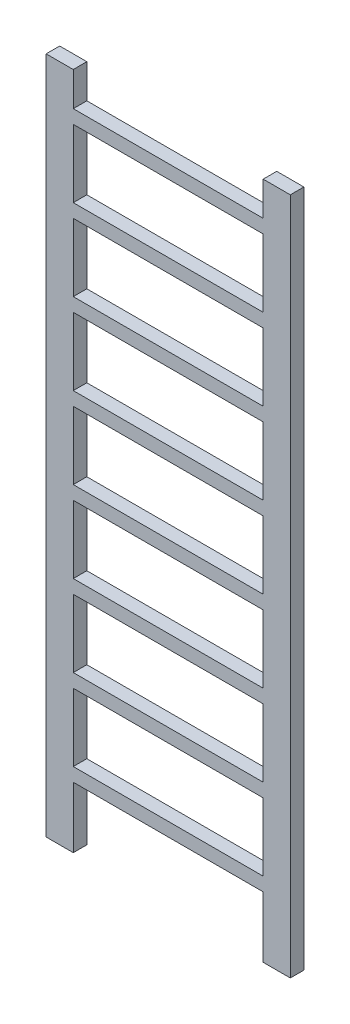
ISO-10303-21;
HEADER;
FILE_DESCRIPTION(('STEP AP214'),'2;1');
FILE_NAME('part.step','',(''),(''),'','','');
FILE_SCHEMA(('AUTOMOTIVE_DESIGN { 1 0 10303 214 1 1 1 1 }'));
ENDSEC;
DATA;
#1=APPLICATION_CONTEXT('core data for automotive mechanical design processes');
#2=APPLICATION_PROTOCOL_DEFINITION('international standard','automotive_design',2000,#1);
#3=PRODUCT_CONTEXT('',#1,'mechanical');
#4=PRODUCT('Part','Part','',(#3));
#5=PRODUCT_RELATED_PRODUCT_CATEGORY('part','',(#4));
#6=PRODUCT_DEFINITION_FORMATION('','',#4);
#7=PRODUCT_DEFINITION_CONTEXT('part definition',#1,'design');
#8=PRODUCT_DEFINITION('design','',#6,#7);
#9=PRODUCT_DEFINITION_SHAPE('','',#8);
#10=(LENGTH_UNIT() NAMED_UNIT(*) SI_UNIT(.MILLI.,.METRE.));
#11=(NAMED_UNIT(*) PLANE_ANGLE_UNIT() SI_UNIT($,.RADIAN.));
#12=(NAMED_UNIT(*) SI_UNIT($,.STERADIAN.) SOLID_ANGLE_UNIT());
#13=UNCERTAINTY_MEASURE_WITH_UNIT(LENGTH_MEASURE(1.E-05),#10,'distance_accuracy_value','');
#14=(GEOMETRIC_REPRESENTATION_CONTEXT(3) GLOBAL_UNCERTAINTY_ASSIGNED_CONTEXT((#13)) GLOBAL_UNIT_ASSIGNED_CONTEXT((#10,
#11,#12)) REPRESENTATION_CONTEXT('',''));
#15=CARTESIAN_POINT('',(0.,0.,0.));
#16=DIRECTION('',(0.,0.,1.));
#17=DIRECTION('',(1.,0.,0.));
#18=AXIS2_PLACEMENT_3D('',#15,#16,#17);
#19=CARTESIAN_POINT('',(-350.,-1250.,50.));
#20=DIRECTION('',(-1.,0.,0.));
#21=DIRECTION('',(0.,0.,1.));
#22=AXIS2_PLACEMENT_3D('',#19,#20,#21);
#23=PLANE('',#22);
#24=DIRECTION('',(0.,0.,1.));
#25=VECTOR('',#24,1.);
#26=CARTESIAN_POINT('',(-350.,-975.,50.));
#27=LINE('',#26,#25);
#28=CARTESIAN_POINT('',(-350.,-975.,0.));
#29=VERTEX_POINT('',#28);
#30=CARTESIAN_POINT('',(-350.,-975.,50.));
#31=VERTEX_POINT('',#30);
#32=EDGE_CURVE('E333',#29,#31,#27,.T.);
#33=ORIENTED_EDGE('',*,*,#32,.F.);
#34=DIRECTION('',(0.,1.,0.));
#35=VECTOR('',#34,1.);
#36=CARTESIAN_POINT('',(-350.,-1250.,0.));
#37=LINE('',#36,#35);
#38=CARTESIAN_POINT('',(-350.,-725.,0.));
#39=VERTEX_POINT('',#38);
#40=EDGE_CURVE('E537',#29,#39,#37,.T.);
#41=ORIENTED_EDGE('',*,*,#40,.T.);
#42=DIRECTION('',(0.,0.,-1.));
#43=VECTOR('',#42,1.);
#44=CARTESIAN_POINT('',(-350.,-725.,50.));
#45=LINE('',#44,#43);
#46=CARTESIAN_POINT('',(-350.,-725.,50.));
#47=VERTEX_POINT('',#46);
#48=EDGE_CURVE('E351',#47,#39,#45,.T.);
#49=ORIENTED_EDGE('',*,*,#48,.F.);
#50=DIRECTION('',(0.,1.,0.));
#51=VECTOR('',#50,1.);
#52=CARTESIAN_POINT('',(-350.,-1250.,50.));
#53=LINE('',#52,#51);
#54=EDGE_CURVE('E526',#31,#47,#53,.T.);
#55=ORIENTED_EDGE('',*,*,#54,.F.);
#56=EDGE_LOOP('',(#33,#41,#49,#55));
#57=FACE_BOUND('',#56,.T.);
#58=ADVANCED_FACE('F41',(#57),#23,.F.);
#59=DIRECTION('',(0.,0.,-1.));
#60=VECTOR('',#59,1.);
#61=CARTESIAN_POINT('',(-350.,-1025.,50.));
#62=LINE('',#61,#60);
#63=CARTESIAN_POINT('',(-350.,-1025.,50.));
#64=VERTEX_POINT('',#63);
#65=CARTESIAN_POINT('',(-350.,-1025.,0.));
#66=VERTEX_POINT('',#65);
#67=EDGE_CURVE('E317',#64,#66,#62,.T.);
#68=ORIENTED_EDGE('',*,*,#67,.F.);
#69=CARTESIAN_POINT('',(-350.,-1250.,50.));
#70=VERTEX_POINT('',#69);
#71=EDGE_CURVE('E522',#70,#64,#53,.T.);
#72=ORIENTED_EDGE('',*,*,#71,.F.);
#73=DIRECTION('',(0.,0.,-1.));
#74=VECTOR('',#73,1.);
#75=CARTESIAN_POINT('',(-350.,-1250.,50.));
#76=LINE('',#75,#74);
#77=CARTESIAN_POINT('',(-350.,-1250.,0.));
#78=VERTEX_POINT('',#77);
#79=EDGE_CURVE('E533',#70,#78,#76,.T.);
#80=ORIENTED_EDGE('',*,*,#79,.T.);
#81=EDGE_CURVE('E534',#78,#66,#37,.T.);
#82=ORIENTED_EDGE('',*,*,#81,.T.);
#83=EDGE_LOOP('',(#68,#72,#80,#82));
#84=FACE_BOUND('',#83,.T.);
#85=ADVANCED_FACE('F724',(#84),#23,.F.);
#86=CARTESIAN_POINT('',(350.,-1250.,50.));
#87=DIRECTION('',(1.,0.,0.));
#88=DIRECTION('',(0.,0.,-1.));
#89=AXIS2_PLACEMENT_3D('',#86,#87,#88);
#90=PLANE('',#89);
#91=DIRECTION('',(0.,0.,-1.));
#92=VECTOR('',#91,1.);
#93=CARTESIAN_POINT('',(350.,-975.,50.));
#94=LINE('',#93,#92);
#95=CARTESIAN_POINT('',(350.,-975.,50.));
#96=VERTEX_POINT('',#95);
#97=CARTESIAN_POINT('',(350.,-975.,0.));
#98=VERTEX_POINT('',#97);
#99=EDGE_CURVE('E64',#96,#98,#94,.T.);
#100=ORIENTED_EDGE('',*,*,#99,.F.);
#101=DIRECTION('',(0.,-1.,0.));
#102=VECTOR('',#101,1.);
#103=CARTESIAN_POINT('',(350.,-1250.,50.));
#104=LINE('',#103,#102);
#105=CARTESIAN_POINT('',(350.,-725.,50.));
#106=VERTEX_POINT('',#105);
#107=EDGE_CURVE('E607',#106,#96,#104,.T.);
#108=ORIENTED_EDGE('',*,*,#107,.F.);
#109=DIRECTION('',(0.,0.,1.));
#110=VECTOR('',#109,1.);
#111=CARTESIAN_POINT('',(350.,-725.,50.));
#112=LINE('',#111,#110);
#113=CARTESIAN_POINT('',(350.,-725.,0.));
#114=VERTEX_POINT('',#113);
#115=EDGE_CURVE('E344',#114,#106,#112,.T.);
#116=ORIENTED_EDGE('',*,*,#115,.F.);
#117=DIRECTION('',(0.,-1.,0.));
#118=VECTOR('',#117,1.);
#119=CARTESIAN_POINT('',(350.,-1250.,0.));
#120=LINE('',#119,#118);
#121=EDGE_CURVE('E308',#114,#98,#120,.T.);
#122=ORIENTED_EDGE('',*,*,#121,.T.);
#123=EDGE_LOOP('',(#100,#108,#116,#122));
#124=FACE_BOUND('',#123,.T.);
#125=ADVANCED_FACE('F594',(#124),#90,.F.);
#126=DIRECTION('',(0.,0.,1.));
#127=VECTOR('',#126,1.);
#128=CARTESIAN_POINT('',(350.,-1025.,50.));
#129=LINE('',#128,#127);
#130=CARTESIAN_POINT('',(350.,-1025.,0.));
#131=VERTEX_POINT('',#130);
#132=CARTESIAN_POINT('',(350.,-1025.,50.));
#133=VERTEX_POINT('',#132);
#134=EDGE_CURVE('E312',#131,#133,#129,.T.);
#135=ORIENTED_EDGE('',*,*,#134,.F.);
#136=CARTESIAN_POINT('',(350.,-1250.,0.));
#137=VERTEX_POINT('',#136);
#138=EDGE_CURVE('E299',#131,#137,#120,.T.);
#139=ORIENTED_EDGE('',*,*,#138,.T.);
#140=DIRECTION('',(0.,0.,-1.));
#141=VECTOR('',#140,1.);
#142=CARTESIAN_POINT('',(350.,-1250.,50.));
#143=LINE('',#142,#141);
#144=CARTESIAN_POINT('',(350.,-1250.,50.));
#145=VERTEX_POINT('',#144);
#146=EDGE_CURVE('E495',#145,#137,#143,.T.);
#147=ORIENTED_EDGE('',*,*,#146,.F.);
#148=EDGE_CURVE('E56',#133,#145,#104,.T.);
#149=ORIENTED_EDGE('',*,*,#148,.F.);
#150=EDGE_LOOP('',(#135,#139,#147,#149));
#151=FACE_BOUND('',#150,.T.);
#152=ADVANCED_FACE('F313',(#151),#90,.F.);
#153=DIRECTION('',(0.,0.,1.));
#154=VECTOR('',#153,1.);
#155=CARTESIAN_POINT('',(-350.,-675.,50.));
#156=LINE('',#155,#154);
#157=CARTESIAN_POINT('',(-350.,-675.,0.));
#158=VERTEX_POINT('',#157);
#159=CARTESIAN_POINT('',(-350.,-675.,50.));
#160=VERTEX_POINT('',#159);
#161=EDGE_CURVE('E357',#158,#160,#156,.T.);
#162=ORIENTED_EDGE('',*,*,#161,.F.);
#163=CARTESIAN_POINT('',(-350.,-425.,0.));
#164=VERTEX_POINT('',#163);
#165=EDGE_CURVE('E604',#158,#164,#37,.T.);
#166=ORIENTED_EDGE('',*,*,#165,.T.);
#167=DIRECTION('',(0.,0.,-1.));
#168=VECTOR('',#167,1.);
#169=CARTESIAN_POINT('',(-350.,-425.,50.));
#170=LINE('',#169,#168);
#171=CARTESIAN_POINT('',(-350.,-425.,50.));
#172=VERTEX_POINT('',#171);
#173=EDGE_CURVE('E375',#172,#164,#170,.T.);
#174=ORIENTED_EDGE('',*,*,#173,.F.);
#175=EDGE_CURVE('E678',#160,#172,#53,.T.);
#176=ORIENTED_EDGE('',*,*,#175,.F.);
#177=EDGE_LOOP('',(#162,#166,#174,#176));
#178=FACE_BOUND('',#177,.T.);
#179=ADVANCED_FACE('F701',(#178),#23,.F.);
#180=DIRECTION('',(0.,0.,-1.));
#181=VECTOR('',#180,1.);
#182=CARTESIAN_POINT('',(350.,-675.,50.));
#183=LINE('',#182,#181);
#184=CARTESIAN_POINT('',(350.,-675.,50.));
#185=VERTEX_POINT('',#184);
#186=CARTESIAN_POINT('',(350.,-675.,0.));
#187=VERTEX_POINT('',#186);
#188=EDGE_CURVE('E354',#185,#187,#183,.T.);
#189=ORIENTED_EDGE('',*,*,#188,.F.);
#190=CARTESIAN_POINT('',(350.,-425.,50.));
#191=VERTEX_POINT('',#190);
#192=EDGE_CURVE('E609',#191,#185,#104,.T.);
#193=ORIENTED_EDGE('',*,*,#192,.F.);
#194=DIRECTION('',(0.,0.,1.));
#195=VECTOR('',#194,1.);
#196=CARTESIAN_POINT('',(350.,-425.,50.));
#197=LINE('',#196,#195);
#198=CARTESIAN_POINT('',(350.,-425.,0.));
#199=VERTEX_POINT('',#198);
#200=EDGE_CURVE('E368',#199,#191,#197,.T.);
#201=ORIENTED_EDGE('',*,*,#200,.F.);
#202=EDGE_CURVE('E588',#199,#187,#120,.T.);
#203=ORIENTED_EDGE('',*,*,#202,.T.);
#204=EDGE_LOOP('',(#189,#193,#201,#203));
#205=FACE_BOUND('',#204,.T.);
#206=ADVANCED_FACE('F708',(#205),#90,.F.);
#207=DIRECTION('',(0.,0.,1.));
#208=VECTOR('',#207,1.);
#209=CARTESIAN_POINT('',(-350.,-375.,50.));
#210=LINE('',#209,#208);
#211=CARTESIAN_POINT('',(-350.,-375.,0.));
#212=VERTEX_POINT('',#211);
#213=CARTESIAN_POINT('',(-350.,-375.,50.));
#214=VERTEX_POINT('',#213);
#215=EDGE_CURVE('E381',#212,#214,#210,.T.);
#216=ORIENTED_EDGE('',*,*,#215,.F.);
#217=CARTESIAN_POINT('',(-350.,-125.,0.));
#218=VERTEX_POINT('',#217);
#219=EDGE_CURVE('E676',#212,#218,#37,.T.);
#220=ORIENTED_EDGE('',*,*,#219,.T.);
#221=DIRECTION('',(0.,0.,-1.));
#222=VECTOR('',#221,1.);
#223=CARTESIAN_POINT('',(-350.,-125.,50.));
#224=LINE('',#223,#222);
#225=CARTESIAN_POINT('',(-350.,-125.,50.));
#226=VERTEX_POINT('',#225);
#227=EDGE_CURVE('E399',#226,#218,#224,.T.);
#228=ORIENTED_EDGE('',*,*,#227,.F.);
#229=EDGE_CURVE('E677',#214,#226,#53,.T.);
#230=ORIENTED_EDGE('',*,*,#229,.F.);
#231=EDGE_LOOP('',(#216,#220,#228,#230));
#232=FACE_BOUND('',#231,.T.);
#233=ADVANCED_FACE('F674',(#232),#23,.F.);
#234=DIRECTION('',(0.,0.,-1.));
#235=VECTOR('',#234,1.);
#236=CARTESIAN_POINT('',(350.,-375.,50.));
#237=LINE('',#236,#235);
#238=CARTESIAN_POINT('',(350.,-375.,50.));
#239=VERTEX_POINT('',#238);
#240=CARTESIAN_POINT('',(350.,-375.,0.));
#241=VERTEX_POINT('',#240);
#242=EDGE_CURVE('E378',#239,#241,#237,.T.);
#243=ORIENTED_EDGE('',*,*,#242,.F.);
#244=CARTESIAN_POINT('',(350.,-125.,50.));
#245=VERTEX_POINT('',#244);
#246=EDGE_CURVE('E611',#245,#239,#104,.T.);
#247=ORIENTED_EDGE('',*,*,#246,.F.);
#248=DIRECTION('',(0.,0.,1.));
#249=VECTOR('',#248,1.);
#250=CARTESIAN_POINT('',(350.,-125.,50.));
#251=LINE('',#250,#249);
#252=CARTESIAN_POINT('',(350.,-125.,0.));
#253=VERTEX_POINT('',#252);
#254=EDGE_CURVE('E392',#253,#245,#251,.T.);
#255=ORIENTED_EDGE('',*,*,#254,.F.);
#256=EDGE_CURVE('E585',#253,#241,#120,.T.);
#257=ORIENTED_EDGE('',*,*,#256,.T.);
#258=EDGE_LOOP('',(#243,#247,#255,#257));
#259=FACE_BOUND('',#258,.T.);
#260=ADVANCED_FACE('F759',(#259),#90,.F.);
#261=DIRECTION('',(0.,0.,1.));
#262=VECTOR('',#261,1.);
#263=CARTESIAN_POINT('',(-350.,-75.,50.));
#264=LINE('',#263,#262);
#265=CARTESIAN_POINT('',(-350.,-75.,0.));
#266=VERTEX_POINT('',#265);
#267=CARTESIAN_POINT('',(-350.,-75.,50.));
#268=VERTEX_POINT('',#267);
#269=EDGE_CURVE('E405',#266,#268,#264,.T.);
#270=ORIENTED_EDGE('',*,*,#269,.F.);
#271=CARTESIAN_POINT('',(-350.,175.,0.));
#272=VERTEX_POINT('',#271);
#273=EDGE_CURVE('E695',#266,#272,#37,.T.);
#274=ORIENTED_EDGE('',*,*,#273,.T.);
#275=DIRECTION('',(0.,0.,-1.));
#276=VECTOR('',#275,1.);
#277=CARTESIAN_POINT('',(-350.,175.,50.));
#278=LINE('',#277,#276);
#279=CARTESIAN_POINT('',(-350.,175.,50.));
#280=VERTEX_POINT('',#279);
#281=EDGE_CURVE('E423',#280,#272,#278,.T.);
#282=ORIENTED_EDGE('',*,*,#281,.F.);
#283=EDGE_CURVE('E679',#268,#280,#53,.T.);
#284=ORIENTED_EDGE('',*,*,#283,.F.);
#285=EDGE_LOOP('',(#270,#274,#282,#284));
#286=FACE_BOUND('',#285,.T.);
#287=ADVANCED_FACE('F754',(#286),#23,.F.);
#288=DIRECTION('',(0.,0.,-1.));
#289=VECTOR('',#288,1.);
#290=CARTESIAN_POINT('',(350.,-75.,50.));
#291=LINE('',#290,#289);
#292=CARTESIAN_POINT('',(350.,-75.,50.));
#293=VERTEX_POINT('',#292);
#294=CARTESIAN_POINT('',(350.,-75.,0.));
#295=VERTEX_POINT('',#294);
#296=EDGE_CURVE('E402',#293,#295,#291,.T.);
#297=ORIENTED_EDGE('',*,*,#296,.F.);
#298=CARTESIAN_POINT('',(350.,175.,50.));
#299=VERTEX_POINT('',#298);
#300=EDGE_CURVE('E659',#299,#293,#104,.T.);
#301=ORIENTED_EDGE('',*,*,#300,.F.);
#302=DIRECTION('',(0.,0.,1.));
#303=VECTOR('',#302,1.);
#304=CARTESIAN_POINT('',(350.,175.,50.));
#305=LINE('',#304,#303);
#306=CARTESIAN_POINT('',(350.,175.,0.));
#307=VERTEX_POINT('',#306);
#308=EDGE_CURVE('E416',#307,#299,#305,.T.);
#309=ORIENTED_EDGE('',*,*,#308,.F.);
#310=EDGE_CURVE('E582',#307,#295,#120,.T.);
#311=ORIENTED_EDGE('',*,*,#310,.T.);
#312=EDGE_LOOP('',(#297,#301,#309,#311));
#313=FACE_BOUND('',#312,.T.);
#314=ADVANCED_FACE('F752',(#313),#90,.F.);
#315=DIRECTION('',(0.,0.,1.));
#316=VECTOR('',#315,1.);
#317=CARTESIAN_POINT('',(-350.,225.,50.));
#318=LINE('',#317,#316);
#319=CARTESIAN_POINT('',(-350.,225.,0.));
#320=VERTEX_POINT('',#319);
#321=CARTESIAN_POINT('',(-350.,225.,50.));
#322=VERTEX_POINT('',#321);
#323=EDGE_CURVE('E429',#320,#322,#318,.T.);
#324=ORIENTED_EDGE('',*,*,#323,.F.);
#325=CARTESIAN_POINT('',(-350.,475.,0.));
#326=VERTEX_POINT('',#325);
#327=EDGE_CURVE('E686',#320,#326,#37,.T.);
#328=ORIENTED_EDGE('',*,*,#327,.T.);
#329=DIRECTION('',(0.,0.,-1.));
#330=VECTOR('',#329,1.);
#331=CARTESIAN_POINT('',(-350.,475.,50.));
#332=LINE('',#331,#330);
#333=CARTESIAN_POINT('',(-350.,475.,50.));
#334=VERTEX_POINT('',#333);
#335=EDGE_CURVE('E447',#334,#326,#332,.T.);
#336=ORIENTED_EDGE('',*,*,#335,.F.);
#337=EDGE_CURVE('E573',#322,#334,#53,.T.);
#338=ORIENTED_EDGE('',*,*,#337,.F.);
#339=EDGE_LOOP('',(#324,#328,#336,#338));
#340=FACE_BOUND('',#339,.T.);
#341=ADVANCED_FACE('F685',(#340),#23,.F.);
#342=DIRECTION('',(0.,0.,-1.));
#343=VECTOR('',#342,1.);
#344=CARTESIAN_POINT('',(350.,225.,50.));
#345=LINE('',#344,#343);
#346=CARTESIAN_POINT('',(350.,225.,50.));
#347=VERTEX_POINT('',#346);
#348=CARTESIAN_POINT('',(350.,225.,0.));
#349=VERTEX_POINT('',#348);
#350=EDGE_CURVE('E426',#347,#349,#345,.T.);
#351=ORIENTED_EDGE('',*,*,#350,.F.);
#352=CARTESIAN_POINT('',(350.,475.,50.));
#353=VERTEX_POINT('',#352);
#354=EDGE_CURVE('E657',#353,#347,#104,.T.);
#355=ORIENTED_EDGE('',*,*,#354,.F.);
#356=DIRECTION('',(0.,0.,1.));
#357=VECTOR('',#356,1.);
#358=CARTESIAN_POINT('',(350.,475.,50.));
#359=LINE('',#358,#357);
#360=CARTESIAN_POINT('',(350.,475.,0.));
#361=VERTEX_POINT('',#360);
#362=EDGE_CURVE('E440',#361,#353,#359,.T.);
#363=ORIENTED_EDGE('',*,*,#362,.F.);
#364=EDGE_CURVE('E581',#361,#349,#120,.T.);
#365=ORIENTED_EDGE('',*,*,#364,.T.);
#366=EDGE_LOOP('',(#351,#355,#363,#365));
#367=FACE_BOUND('',#366,.T.);
#368=ADVANCED_FACE('F690',(#367),#90,.F.);
#369=DIRECTION('',(0.,0.,1.));
#370=VECTOR('',#369,1.);
#371=CARTESIAN_POINT('',(-350.,525.,50.));
#372=LINE('',#371,#370);
#373=CARTESIAN_POINT('',(-350.,525.,0.));
#374=VERTEX_POINT('',#373);
#375=CARTESIAN_POINT('',(-350.,525.,50.));
#376=VERTEX_POINT('',#375);
#377=EDGE_CURVE('E453',#374,#376,#372,.T.);
#378=ORIENTED_EDGE('',*,*,#377,.F.);
#379=CARTESIAN_POINT('',(-350.,775.,0.));
#380=VERTEX_POINT('',#379);
#381=EDGE_CURVE('E576',#374,#380,#37,.T.);
#382=ORIENTED_EDGE('',*,*,#381,.T.);
#383=DIRECTION('',(0.,0.,-1.));
#384=VECTOR('',#383,1.);
#385=CARTESIAN_POINT('',(-350.,775.,50.));
#386=LINE('',#385,#384);
#387=CARTESIAN_POINT('',(-350.,775.,50.));
#388=VERTEX_POINT('',#387);
#389=EDGE_CURVE('E464',#388,#380,#386,.T.);
#390=ORIENTED_EDGE('',*,*,#389,.F.);
#391=EDGE_CURVE('E569',#376,#388,#53,.T.);
#392=ORIENTED_EDGE('',*,*,#391,.F.);
#393=EDGE_LOOP('',(#378,#382,#390,#392));
#394=FACE_BOUND('',#393,.T.);
#395=ADVANCED_FACE('F575',(#394),#23,.F.);
#396=DIRECTION('',(0.,0.,-1.));
#397=VECTOR('',#396,1.);
#398=CARTESIAN_POINT('',(350.,525.,50.));
#399=LINE('',#398,#397);
#400=CARTESIAN_POINT('',(350.,525.,50.));
#401=VERTEX_POINT('',#400);
#402=CARTESIAN_POINT('',(350.,525.,0.));
#403=VERTEX_POINT('',#402);
#404=EDGE_CURVE('E450',#401,#403,#399,.T.);
#405=ORIENTED_EDGE('',*,*,#404,.F.);
#406=CARTESIAN_POINT('',(350.,775.,50.));
#407=VERTEX_POINT('',#406);
#408=EDGE_CURVE('E567',#407,#401,#104,.T.);
#409=ORIENTED_EDGE('',*,*,#408,.F.);
#410=DIRECTION('',(0.,0.,1.));
#411=VECTOR('',#410,1.);
#412=CARTESIAN_POINT('',(350.,775.,50.));
#413=LINE('',#412,#411);
#414=CARTESIAN_POINT('',(350.,775.,0.));
#415=VERTEX_POINT('',#414);
#416=EDGE_CURVE('E49',#415,#407,#413,.T.);
#417=ORIENTED_EDGE('',*,*,#416,.F.);
#418=EDGE_CURVE('E580',#415,#403,#120,.T.);
#419=ORIENTED_EDGE('',*,*,#418,.T.);
#420=EDGE_LOOP('',(#405,#409,#417,#419));
#421=FACE_BOUND('',#420,.T.);
#422=ADVANCED_FACE('F740',(#421),#90,.F.);
#423=DIRECTION('',(0.,0.,1.));
#424=VECTOR('',#423,1.);
#425=CARTESIAN_POINT('',(-350.,825.,50.));
#426=LINE('',#425,#424);
#427=CARTESIAN_POINT('',(-350.,825.,0.));
#428=VERTEX_POINT('',#427);
#429=CARTESIAN_POINT('',(-350.,825.,50.));
#430=VERTEX_POINT('',#429);
#431=EDGE_CURVE('E471',#428,#430,#426,.T.);
#432=ORIENTED_EDGE('',*,*,#431,.F.);
#433=CARTESIAN_POINT('',(-350.,1075.,0.));
#434=VERTEX_POINT('',#433);
#435=EDGE_CURVE('E637',#428,#434,#37,.T.);
#436=ORIENTED_EDGE('',*,*,#435,.T.);
#437=DIRECTION('',(0.,0.,-1.));
#438=VECTOR('',#437,1.);
#439=CARTESIAN_POINT('',(-350.,1075.,50.));
#440=LINE('',#439,#438);
#441=CARTESIAN_POINT('',(-350.,1075.,50.));
#442=VERTEX_POINT('',#441);
#443=EDGE_CURVE('E513',#442,#434,#440,.T.);
#444=ORIENTED_EDGE('',*,*,#443,.F.);
#445=EDGE_CURVE('E574',#430,#442,#53,.T.);
#446=ORIENTED_EDGE('',*,*,#445,.F.);
#447=EDGE_LOOP('',(#432,#436,#444,#446));
#448=FACE_BOUND('',#447,.T.);
#449=ADVANCED_FACE('F647',(#448),#23,.F.);
#450=DIRECTION('',(0.,0.,-1.));
#451=VECTOR('',#450,1.);
#452=CARTESIAN_POINT('',(350.,825.,50.));
#453=LINE('',#452,#451);
#454=CARTESIAN_POINT('',(350.,825.,50.));
#455=VERTEX_POINT('',#454);
#456=CARTESIAN_POINT('',(350.,825.,0.));
#457=VERTEX_POINT('',#456);
#458=EDGE_CURVE('E11',#455,#457,#453,.T.);
#459=ORIENTED_EDGE('',*,*,#458,.F.);
#460=CARTESIAN_POINT('',(350.,1075.,50.));
#461=VERTEX_POINT('',#460);
#462=EDGE_CURVE('E484',#461,#455,#104,.T.);
#463=ORIENTED_EDGE('',*,*,#462,.F.);
#464=DIRECTION('',(0.,0.,-1.));
#465=VECTOR('',#464,1.);
#466=CARTESIAN_POINT('',(350.,1075.,50.));
#467=LINE('',#466,#465);
#468=CARTESIAN_POINT('',(350.,1075.,0.));
#469=VERTEX_POINT('',#468);
#470=EDGE_CURVE('E554',#461,#469,#467,.T.);
#471=ORIENTED_EDGE('',*,*,#470,.T.);
#472=EDGE_CURVE('E491',#469,#457,#120,.T.);
#473=ORIENTED_EDGE('',*,*,#472,.T.);
#474=EDGE_LOOP('',(#459,#463,#471,#473));
#475=FACE_BOUND('',#474,.T.);
#476=ADVANCED_FACE('F653',(#475),#90,.F.);
#477=CARTESIAN_POINT('',(-400.,1125.,50.));
#478=DIRECTION('',(0.,-1.,0.));
#479=DIRECTION('',(0.,0.,-1.));
#480=AXIS2_PLACEMENT_3D('',#477,#478,#479);
#481=PLANE('',#480);
#482=DIRECTION('',(0.,0.,1.));
#483=VECTOR('',#482,1.);
#484=CARTESIAN_POINT('',(350.,1125.,50.));
#485=LINE('',#484,#483);
#486=CARTESIAN_POINT('',(350.,1125.,0.));
#487=VERTEX_POINT('',#486);
#488=CARTESIAN_POINT('',(350.,1125.,50.));
#489=VERTEX_POINT('',#488);
#490=EDGE_CURVE('E503',#487,#489,#485,.T.);
#491=ORIENTED_EDGE('',*,*,#490,.F.);
#492=DIRECTION('',(-1.,0.,0.));
#493=VECTOR('',#492,1.);
#494=CARTESIAN_POINT('',(-400.,1125.,0.));
#495=LINE('',#494,#493);
#496=CARTESIAN_POINT('',(-350.,1125.,0.));
#497=VERTEX_POINT('',#496);
#498=EDGE_CURVE('E506',#487,#497,#495,.T.);
#499=ORIENTED_EDGE('',*,*,#498,.T.);
#500=DIRECTION('',(0.,0.,1.));
#501=VECTOR('',#500,1.);
#502=CARTESIAN_POINT('',(-350.,1125.,50.));
#503=LINE('',#502,#501);
#504=CARTESIAN_POINT('',(-350.,1125.,50.));
#505=VERTEX_POINT('',#504);
#506=EDGE_CURVE('E518',#497,#505,#503,.T.);
#507=ORIENTED_EDGE('',*,*,#506,.T.);
#508=DIRECTION('',(-1.,0.,0.));
#509=VECTOR('',#508,1.);
#510=CARTESIAN_POINT('',(-400.,1125.,50.));
#511=LINE('',#510,#509);
#512=EDGE_CURVE('E507',#489,#505,#511,.T.);
#513=ORIENTED_EDGE('',*,*,#512,.F.);
#514=EDGE_LOOP('',(#491,#499,#507,#513));
#515=FACE_BOUND('',#514,.T.);
#516=ADVANCED_FACE('F630',(#515),#481,.F.);
#517=CARTESIAN_POINT('',(-400.,1075.,50.));
#518=DIRECTION('',(0.,1.,0.));
#519=DIRECTION('',(0.,0.,1.));
#520=AXIS2_PLACEMENT_3D('',#517,#518,#519);
#521=PLANE('',#520);
#522=ORIENTED_EDGE('',*,*,#470,.F.);
#523=DIRECTION('',(1.,0.,0.));
#524=VECTOR('',#523,1.);
#525=CARTESIAN_POINT('',(-400.,1075.,50.));
#526=LINE('',#525,#524);
#527=EDGE_CURVE('E509',#442,#461,#526,.T.);
#528=ORIENTED_EDGE('',*,*,#527,.F.);
#529=ORIENTED_EDGE('',*,*,#443,.T.);
#530=DIRECTION('',(1.,0.,0.));
#531=VECTOR('',#530,1.);
#532=CARTESIAN_POINT('',(-400.,1075.,0.));
#533=LINE('',#532,#531);
#534=EDGE_CURVE('E510',#434,#469,#533,.T.);
#535=ORIENTED_EDGE('',*,*,#534,.T.);
#536=EDGE_LOOP('',(#522,#528,#529,#535));
#537=FACE_BOUND('',#536,.T.);
#538=ADVANCED_FACE('F650',(#537),#521,.F.);
#539=ORIENTED_EDGE('',*,*,#506,.F.);
#540=CARTESIAN_POINT('',(-350.,1250.,0.));
#541=VERTEX_POINT('',#540);
#542=EDGE_CURVE('E521',#497,#541,#37,.T.);
#543=ORIENTED_EDGE('',*,*,#542,.T.);
#544=DIRECTION('',(0.,0.,-1.));
#545=VECTOR('',#544,1.);
#546=CARTESIAN_POINT('',(-350.,1250.,50.));
#547=LINE('',#546,#545);
#548=CARTESIAN_POINT('',(-350.,1250.,50.));
#549=VERTEX_POINT('',#548);
#550=EDGE_CURVE('E551',#549,#541,#547,.T.);
#551=ORIENTED_EDGE('',*,*,#550,.F.);
#552=EDGE_CURVE('E527',#505,#549,#53,.T.);
#553=ORIENTED_EDGE('',*,*,#552,.F.);
#554=EDGE_LOOP('',(#539,#543,#551,#553));
#555=FACE_BOUND('',#554,.T.);
#556=ADVANCED_FACE('F43',(#555),#23,.F.);
#557=CARTESIAN_POINT('',(-450.,1250.,50.));
#558=DIRECTION('',(0.,-1.,0.));
#559=DIRECTION('',(0.,0.,-1.));
#560=AXIS2_PLACEMENT_3D('',#557,#558,#559);
#561=PLANE('',#560);
#562=DIRECTION('',(-1.,0.,0.));
#563=VECTOR('',#562,1.);
#564=CARTESIAN_POINT('',(-450.,1250.,0.));
#565=LINE('',#564,#563);
#566=CARTESIAN_POINT('',(-450.,1250.,0.));
#567=VERTEX_POINT('',#566);
#568=EDGE_CURVE('E536',#541,#567,#565,.T.);
#569=ORIENTED_EDGE('',*,*,#568,.T.);
#570=DIRECTION('',(0.,0.,-1.));
#571=VECTOR('',#570,1.);
#572=CARTESIAN_POINT('',(-450.,1250.,50.));
#573=LINE('',#572,#571);
#574=CARTESIAN_POINT('',(-450.,1250.,50.));
#575=VERTEX_POINT('',#574);
#576=EDGE_CURVE('E548',#575,#567,#573,.T.);
#577=ORIENTED_EDGE('',*,*,#576,.F.);
#578=DIRECTION('',(-1.,0.,0.));
#579=VECTOR('',#578,1.);
#580=CARTESIAN_POINT('',(-450.,1250.,50.));
#581=LINE('',#580,#579);
#582=EDGE_CURVE('E525',#549,#575,#581,.T.);
#583=ORIENTED_EDGE('',*,*,#582,.F.);
#584=ORIENTED_EDGE('',*,*,#550,.T.);
#585=EDGE_LOOP('',(#569,#577,#583,#584));
#586=FACE_BOUND('',#585,.T.);
#587=ADVANCED_FACE('F730',(#586),#561,.F.);
#588=CARTESIAN_POINT('',(-450.,-1250.,50.));
#589=DIRECTION('',(1.,0.,0.));
#590=DIRECTION('',(0.,0.,-1.));
#591=AXIS2_PLACEMENT_3D('',#588,#589,#590);
#592=PLANE('',#591);
#593=DIRECTION('',(0.,-1.,0.));
#594=VECTOR('',#593,1.);
#595=CARTESIAN_POINT('',(-450.,-1250.,0.));
#596=LINE('',#595,#594);
#597=CARTESIAN_POINT('',(-450.,-1250.,0.));
#598=VERTEX_POINT('',#597);
#599=EDGE_CURVE('E539',#567,#598,#596,.T.);
#600=ORIENTED_EDGE('',*,*,#599,.T.);
#601=DIRECTION('',(0.,0.,-1.));
#602=VECTOR('',#601,1.);
#603=CARTESIAN_POINT('',(-450.,-1250.,50.));
#604=LINE('',#603,#602);
#605=CARTESIAN_POINT('',(-450.,-1250.,50.));
#606=VERTEX_POINT('',#605);
#607=EDGE_CURVE('E545',#606,#598,#604,.T.);
#608=ORIENTED_EDGE('',*,*,#607,.F.);
#609=DIRECTION('',(0.,-1.,0.));
#610=VECTOR('',#609,1.);
#611=CARTESIAN_POINT('',(-450.,-1250.,50.));
#612=LINE('',#611,#610);
#613=EDGE_CURVE('E529',#575,#606,#612,.T.);
#614=ORIENTED_EDGE('',*,*,#613,.F.);
#615=ORIENTED_EDGE('',*,*,#576,.T.);
#616=EDGE_LOOP('',(#600,#608,#614,#615));
#617=FACE_BOUND('',#616,.T.);
#618=ADVANCED_FACE('F736',(#617),#592,.F.);
#619=CARTESIAN_POINT('',(-450.,-1250.,50.));
#620=DIRECTION('',(0.,1.,0.));
#621=DIRECTION('',(0.,0.,1.));
#622=AXIS2_PLACEMENT_3D('',#619,#620,#621);
#623=PLANE('',#622);
#624=DIRECTION('',(1.,0.,0.));
#625=VECTOR('',#624,1.);
#626=CARTESIAN_POINT('',(-450.,-1250.,0.));
#627=LINE('',#626,#625);
#628=EDGE_CURVE('E541',#598,#78,#627,.T.);
#629=ORIENTED_EDGE('',*,*,#628,.T.);
#630=ORIENTED_EDGE('',*,*,#79,.F.);
#631=DIRECTION('',(1.,0.,0.));
#632=VECTOR('',#631,1.);
#633=CARTESIAN_POINT('',(-450.,-1250.,50.));
#634=LINE('',#633,#632);
#635=EDGE_CURVE('E531',#606,#70,#634,.T.);
#636=ORIENTED_EDGE('',*,*,#635,.F.);
#637=ORIENTED_EDGE('',*,*,#607,.T.);
#638=EDGE_LOOP('',(#629,#630,#636,#637));
#639=FACE_BOUND('',#638,.T.);
#640=ADVANCED_FACE('F787',(#639),#623,.F.);
#641=CARTESIAN_POINT('',(0.,0.,50.));
#642=DIRECTION('',(0.,0.,-1.));
#643=DIRECTION('',(-1.,0.,0.));
#644=AXIS2_PLACEMENT_3D('',#641,#642,#643);
#645=PLANE('',#644);
#646=DIRECTION('',(-1.,0.,0.));
#647=VECTOR('',#646,1.);
#648=CARTESIAN_POINT('',(-400.,-975.,50.));
#649=LINE('',#648,#647);
#650=EDGE_CURVE('E322',#96,#31,#649,.T.);
#651=ORIENTED_EDGE('',*,*,#650,.T.);
#652=ORIENTED_EDGE('',*,*,#54,.T.);
#653=DIRECTION('',(1.,0.,0.));
#654=VECTOR('',#653,1.);
#655=CARTESIAN_POINT('',(-400.,-725.,50.));
#656=LINE('',#655,#654);
#657=EDGE_CURVE('E340',#47,#106,#656,.T.);
#658=ORIENTED_EDGE('',*,*,#657,.T.);
#659=ORIENTED_EDGE('',*,*,#107,.T.);
#660=EDGE_LOOP('',(#651,#652,#658,#659));
#661=FACE_BOUND('',#660,.T.);
#662=ORIENTED_EDGE('',*,*,#71,.T.);
#663=DIRECTION('',(1.,0.,0.));
#664=VECTOR('',#663,1.);
#665=CARTESIAN_POINT('',(-400.,-1025.,50.));
#666=LINE('',#665,#664);
#667=EDGE_CURVE('E318',#64,#133,#666,.T.);
#668=ORIENTED_EDGE('',*,*,#667,.T.);
#669=ORIENTED_EDGE('',*,*,#148,.T.);
#670=DIRECTION('',(1.,0.,0.));
#671=VECTOR('',#670,1.);
#672=CARTESIAN_POINT('',(350.,-1250.,50.));
#673=LINE('',#672,#671);
#674=CARTESIAN_POINT('',(450.,-1250.,50.));
#675=VERTEX_POINT('',#674);
#676=EDGE_CURVE('E483',#145,#675,#673,.T.);
#677=ORIENTED_EDGE('',*,*,#676,.T.);
#678=DIRECTION('',(0.,1.,0.));
#679=VECTOR('',#678,1.);
#680=CARTESIAN_POINT('',(450.,-1250.,50.));
#681=LINE('',#680,#679);
#682=CARTESIAN_POINT('',(450.,1250.,50.));
#683=VERTEX_POINT('',#682);
#684=EDGE_CURVE('E475',#675,#683,#681,.T.);
#685=ORIENTED_EDGE('',*,*,#684,.T.);
#686=DIRECTION('',(-1.,0.,0.));
#687=VECTOR('',#686,1.);
#688=CARTESIAN_POINT('',(350.,1250.,50.));
#689=LINE('',#688,#687);
#690=CARTESIAN_POINT('',(350.,1250.,50.));
#691=VERTEX_POINT('',#690);
#692=EDGE_CURVE('E478',#683,#691,#689,.T.);
#693=ORIENTED_EDGE('',*,*,#692,.T.);
#694=EDGE_CURVE('E480',#691,#489,#104,.T.);
#695=ORIENTED_EDGE('',*,*,#694,.T.);
#696=ORIENTED_EDGE('',*,*,#512,.T.);
#697=ORIENTED_EDGE('',*,*,#552,.T.);
#698=ORIENTED_EDGE('',*,*,#582,.T.);
#699=ORIENTED_EDGE('',*,*,#613,.T.);
#700=ORIENTED_EDGE('',*,*,#635,.T.);
#701=EDGE_LOOP('',(#662,#668,#669,#677,#685,#693,#695,#696,#697,#698,#699,#700));
#702=FACE_BOUND('',#701,.T.);
#703=DIRECTION('',(-1.,0.,0.));
#704=VECTOR('',#703,1.);
#705=CARTESIAN_POINT('',(-400.,-675.,50.));
#706=LINE('',#705,#704);
#707=EDGE_CURVE('E337',#185,#160,#706,.T.);
#708=ORIENTED_EDGE('',*,*,#707,.T.);
#709=ORIENTED_EDGE('',*,*,#175,.T.);
#710=DIRECTION('',(1.,0.,0.));
#711=VECTOR('',#710,1.);
#712=CARTESIAN_POINT('',(-400.,-425.,50.));
#713=LINE('',#712,#711);
#714=EDGE_CURVE('E364',#172,#191,#713,.T.);
#715=ORIENTED_EDGE('',*,*,#714,.T.);
#716=ORIENTED_EDGE('',*,*,#192,.T.);
#717=EDGE_LOOP('',(#708,#709,#715,#716));
#718=FACE_BOUND('',#717,.T.);
#719=DIRECTION('',(-1.,0.,0.));
#720=VECTOR('',#719,1.);
#721=CARTESIAN_POINT('',(-400.,-375.,50.));
#722=LINE('',#721,#720);
#723=EDGE_CURVE('E361',#239,#214,#722,.T.);
#724=ORIENTED_EDGE('',*,*,#723,.T.);
#725=ORIENTED_EDGE('',*,*,#229,.T.);
#726=DIRECTION('',(1.,0.,0.));
#727=VECTOR('',#726,1.);
#728=CARTESIAN_POINT('',(-400.,-125.,50.));
#729=LINE('',#728,#727);
#730=EDGE_CURVE('E388',#226,#245,#729,.T.);
#731=ORIENTED_EDGE('',*,*,#730,.T.);
#732=ORIENTED_EDGE('',*,*,#246,.T.);
#733=EDGE_LOOP('',(#724,#725,#731,#732));
#734=FACE_BOUND('',#733,.T.);
#735=DIRECTION('',(-1.,0.,0.));
#736=VECTOR('',#735,1.);
#737=CARTESIAN_POINT('',(-400.,-75.,50.));
#738=LINE('',#737,#736);
#739=EDGE_CURVE('E385',#293,#268,#738,.T.);
#740=ORIENTED_EDGE('',*,*,#739,.T.);
#741=ORIENTED_EDGE('',*,*,#283,.T.);
#742=DIRECTION('',(1.,0.,0.));
#743=VECTOR('',#742,1.);
#744=CARTESIAN_POINT('',(-400.,175.,50.));
#745=LINE('',#744,#743);
#746=EDGE_CURVE('E412',#280,#299,#745,.T.);
#747=ORIENTED_EDGE('',*,*,#746,.T.);
#748=ORIENTED_EDGE('',*,*,#300,.T.);
#749=EDGE_LOOP('',(#740,#741,#747,#748));
#750=FACE_BOUND('',#749,.T.);
#751=DIRECTION('',(-1.,0.,0.));
#752=VECTOR('',#751,1.);
#753=CARTESIAN_POINT('',(-400.,225.,50.));
#754=LINE('',#753,#752);
#755=EDGE_CURVE('E409',#347,#322,#754,.T.);
#756=ORIENTED_EDGE('',*,*,#755,.T.);
#757=ORIENTED_EDGE('',*,*,#337,.T.);
#758=DIRECTION('',(1.,0.,0.));
#759=VECTOR('',#758,1.);
#760=CARTESIAN_POINT('',(-400.,475.,50.));
#761=LINE('',#760,#759);
#762=EDGE_CURVE('E436',#334,#353,#761,.T.);
#763=ORIENTED_EDGE('',*,*,#762,.T.);
#764=ORIENTED_EDGE('',*,*,#354,.T.);
#765=EDGE_LOOP('',(#756,#757,#763,#764));
#766=FACE_BOUND('',#765,.T.);
#767=DIRECTION('',(-1.,0.,0.));
#768=VECTOR('',#767,1.);
#769=CARTESIAN_POINT('',(-400.,525.,50.));
#770=LINE('',#769,#768);
#771=EDGE_CURVE('E433',#401,#376,#770,.T.);
#772=ORIENTED_EDGE('',*,*,#771,.T.);
#773=ORIENTED_EDGE('',*,*,#391,.T.);
#774=DIRECTION('',(1.,0.,0.));
#775=VECTOR('',#774,1.);
#776=CARTESIAN_POINT('',(-400.,775.,50.));
#777=LINE('',#776,#775);
#778=EDGE_CURVE('E460',#388,#407,#777,.T.);
#779=ORIENTED_EDGE('',*,*,#778,.T.);
#780=ORIENTED_EDGE('',*,*,#408,.T.);
#781=EDGE_LOOP('',(#772,#773,#779,#780));
#782=FACE_BOUND('',#781,.T.);
#783=ORIENTED_EDGE('',*,*,#462,.T.);
#784=DIRECTION('',(-1.,0.,0.));
#785=VECTOR('',#784,1.);
#786=CARTESIAN_POINT('',(-400.,825.,50.));
#787=LINE('',#786,#785);
#788=EDGE_CURVE('E457',#455,#430,#787,.T.);
#789=ORIENTED_EDGE('',*,*,#788,.T.);
#790=ORIENTED_EDGE('',*,*,#445,.T.);
#791=ORIENTED_EDGE('',*,*,#527,.T.);
#792=EDGE_LOOP('',(#783,#789,#790,#791));
#793=FACE_BOUND('',#792,.T.);
#794=ADVANCED_FACE('F565',(#661,#702,#718,#734,#750,#766,#782,#793),#645,.F.);
#795=CARTESIAN_POINT('',(0.,0.,0.));
#796=DIRECTION('',(0.,0.,-1.));
#797=DIRECTION('',(-1.,0.,0.));
#798=AXIS2_PLACEMENT_3D('',#795,#796,#797);
#799=PLANE('',#798);
#800=ORIENTED_EDGE('',*,*,#40,.F.);
#801=DIRECTION('',(-1.,0.,0.));
#802=VECTOR('',#801,1.);
#803=CARTESIAN_POINT('',(-400.,-975.,0.));
#804=LINE('',#803,#802);
#805=EDGE_CURVE('E323',#98,#29,#804,.T.);
#806=ORIENTED_EDGE('',*,*,#805,.F.);
#807=ORIENTED_EDGE('',*,*,#121,.F.);
#808=DIRECTION('',(1.,0.,0.));
#809=VECTOR('',#808,1.);
#810=CARTESIAN_POINT('',(-400.,-725.,0.));
#811=LINE('',#810,#809);
#812=EDGE_CURVE('E341',#39,#114,#811,.T.);
#813=ORIENTED_EDGE('',*,*,#812,.F.);
#814=EDGE_LOOP('',(#800,#806,#807,#813));
#815=FACE_BOUND('',#814,.T.);
#816=ORIENTED_EDGE('',*,*,#138,.F.);
#817=DIRECTION('',(1.,0.,0.));
#818=VECTOR('',#817,1.);
#819=CARTESIAN_POINT('',(-400.,-1025.,0.));
#820=LINE('',#819,#818);
#821=EDGE_CURVE('E304',#66,#131,#820,.T.);
#822=ORIENTED_EDGE('',*,*,#821,.F.);
#823=ORIENTED_EDGE('',*,*,#81,.F.);
#824=ORIENTED_EDGE('',*,*,#628,.F.);
#825=ORIENTED_EDGE('',*,*,#599,.F.);
#826=ORIENTED_EDGE('',*,*,#568,.F.);
#827=ORIENTED_EDGE('',*,*,#542,.F.);
#828=ORIENTED_EDGE('',*,*,#498,.F.);
#829=CARTESIAN_POINT('',(350.,1250.,0.));
#830=VERTEX_POINT('',#829);
#831=EDGE_CURVE('E311',#830,#487,#120,.T.);
#832=ORIENTED_EDGE('',*,*,#831,.F.);
#833=DIRECTION('',(-1.,0.,0.));
#834=VECTOR('',#833,1.);
#835=CARTESIAN_POINT('',(350.,1250.,0.));
#836=LINE('',#835,#834);
#837=CARTESIAN_POINT('',(450.,1250.,0.));
#838=VERTEX_POINT('',#837);
#839=EDGE_CURVE('E309',#838,#830,#836,.T.);
#840=ORIENTED_EDGE('',*,*,#839,.F.);
#841=DIRECTION('',(0.,1.,0.));
#842=VECTOR('',#841,1.);
#843=CARTESIAN_POINT('',(450.,-1250.,0.));
#844=LINE('',#843,#842);
#845=CARTESIAN_POINT('',(450.,-1250.,0.));
#846=VERTEX_POINT('',#845);
#847=EDGE_CURVE('E474',#846,#838,#844,.T.);
#848=ORIENTED_EDGE('',*,*,#847,.F.);
#849=DIRECTION('',(1.,0.,0.));
#850=VECTOR('',#849,1.);
#851=CARTESIAN_POINT('',(350.,-1250.,0.));
#852=LINE('',#851,#850);
#853=EDGE_CURVE('E306',#137,#846,#852,.T.);
#854=ORIENTED_EDGE('',*,*,#853,.F.);
#855=EDGE_LOOP('',(#816,#822,#823,#824,#825,#826,#827,#828,#832,#840,#848,#854));
#856=FACE_BOUND('',#855,.T.);
#857=ORIENTED_EDGE('',*,*,#165,.F.);
#858=DIRECTION('',(-1.,0.,0.));
#859=VECTOR('',#858,1.);
#860=CARTESIAN_POINT('',(-400.,-675.,0.));
#861=LINE('',#860,#859);
#862=EDGE_CURVE('E336',#187,#158,#861,.T.);
#863=ORIENTED_EDGE('',*,*,#862,.F.);
#864=ORIENTED_EDGE('',*,*,#202,.F.);
#865=DIRECTION('',(1.,0.,0.));
#866=VECTOR('',#865,1.);
#867=CARTESIAN_POINT('',(-400.,-425.,0.));
#868=LINE('',#867,#866);
#869=EDGE_CURVE('E365',#164,#199,#868,.T.);
#870=ORIENTED_EDGE('',*,*,#869,.F.);
#871=EDGE_LOOP('',(#857,#863,#864,#870));
#872=FACE_BOUND('',#871,.T.);
#873=ORIENTED_EDGE('',*,*,#219,.F.);
#874=DIRECTION('',(-1.,0.,0.));
#875=VECTOR('',#874,1.);
#876=CARTESIAN_POINT('',(-400.,-375.,0.));
#877=LINE('',#876,#875);
#878=EDGE_CURVE('E360',#241,#212,#877,.T.);
#879=ORIENTED_EDGE('',*,*,#878,.F.);
#880=ORIENTED_EDGE('',*,*,#256,.F.);
#881=DIRECTION('',(1.,0.,0.));
#882=VECTOR('',#881,1.);
#883=CARTESIAN_POINT('',(-400.,-125.,0.));
#884=LINE('',#883,#882);
#885=EDGE_CURVE('E389',#218,#253,#884,.T.);
#886=ORIENTED_EDGE('',*,*,#885,.F.);
#887=EDGE_LOOP('',(#873,#879,#880,#886));
#888=FACE_BOUND('',#887,.T.);
#889=ORIENTED_EDGE('',*,*,#273,.F.);
#890=DIRECTION('',(-1.,0.,0.));
#891=VECTOR('',#890,1.);
#892=CARTESIAN_POINT('',(-400.,-75.,0.));
#893=LINE('',#892,#891);
#894=EDGE_CURVE('E384',#295,#266,#893,.T.);
#895=ORIENTED_EDGE('',*,*,#894,.F.);
#896=ORIENTED_EDGE('',*,*,#310,.F.);
#897=DIRECTION('',(1.,0.,0.));
#898=VECTOR('',#897,1.);
#899=CARTESIAN_POINT('',(-400.,175.,0.));
#900=LINE('',#899,#898);
#901=EDGE_CURVE('E413',#272,#307,#900,.T.);
#902=ORIENTED_EDGE('',*,*,#901,.F.);
#903=EDGE_LOOP('',(#889,#895,#896,#902));
#904=FACE_BOUND('',#903,.T.);
#905=ORIENTED_EDGE('',*,*,#327,.F.);
#906=DIRECTION('',(-1.,0.,0.));
#907=VECTOR('',#906,1.);
#908=CARTESIAN_POINT('',(-400.,225.,0.));
#909=LINE('',#908,#907);
#910=EDGE_CURVE('E408',#349,#320,#909,.T.);
#911=ORIENTED_EDGE('',*,*,#910,.F.);
#912=ORIENTED_EDGE('',*,*,#364,.F.);
#913=DIRECTION('',(1.,0.,0.));
#914=VECTOR('',#913,1.);
#915=CARTESIAN_POINT('',(-400.,475.,0.));
#916=LINE('',#915,#914);
#917=EDGE_CURVE('E437',#326,#361,#916,.T.);
#918=ORIENTED_EDGE('',*,*,#917,.F.);
#919=EDGE_LOOP('',(#905,#911,#912,#918));
#920=FACE_BOUND('',#919,.T.);
#921=ORIENTED_EDGE('',*,*,#381,.F.);
#922=DIRECTION('',(-1.,0.,0.));
#923=VECTOR('',#922,1.);
#924=CARTESIAN_POINT('',(-400.,525.,0.));
#925=LINE('',#924,#923);
#926=EDGE_CURVE('E432',#403,#374,#925,.T.);
#927=ORIENTED_EDGE('',*,*,#926,.F.);
#928=ORIENTED_EDGE('',*,*,#418,.F.);
#929=DIRECTION('',(1.,0.,0.));
#930=VECTOR('',#929,1.);
#931=CARTESIAN_POINT('',(-400.,775.,0.));
#932=LINE('',#931,#930);
#933=EDGE_CURVE('E461',#380,#415,#932,.T.);
#934=ORIENTED_EDGE('',*,*,#933,.F.);
#935=EDGE_LOOP('',(#921,#927,#928,#934));
#936=FACE_BOUND('',#935,.T.);
#937=DIRECTION('',(-1.,0.,0.));
#938=VECTOR('',#937,1.);
#939=CARTESIAN_POINT('',(-400.,825.,0.));
#940=LINE('',#939,#938);
#941=EDGE_CURVE('E456',#457,#428,#940,.T.);
#942=ORIENTED_EDGE('',*,*,#941,.F.);
#943=ORIENTED_EDGE('',*,*,#472,.F.);
#944=ORIENTED_EDGE('',*,*,#534,.F.);
#945=ORIENTED_EDGE('',*,*,#435,.F.);
#946=EDGE_LOOP('',(#942,#943,#944,#945));
#947=FACE_BOUND('',#946,.T.);
#948=ADVANCED_FACE('F300',(#815,#856,#872,#888,#904,#920,#936,#947),#799,.T.);
#949=ORIENTED_EDGE('',*,*,#831,.T.);
#950=ORIENTED_EDGE('',*,*,#490,.T.);
#951=ORIENTED_EDGE('',*,*,#694,.F.);
#952=DIRECTION('',(0.,0.,-1.));
#953=VECTOR('',#952,1.);
#954=CARTESIAN_POINT('',(350.,1250.,50.));
#955=LINE('',#954,#953);
#956=EDGE_CURVE('E497',#691,#830,#955,.T.);
#957=ORIENTED_EDGE('',*,*,#956,.T.);
#958=EDGE_LOOP('',(#949,#950,#951,#957));
#959=FACE_BOUND('',#958,.T.);
#960=ADVANCED_FACE('F627',(#959),#90,.F.);
#961=CARTESIAN_POINT('',(450.,-1250.,50.));
#962=DIRECTION('',(-1.,0.,0.));
#963=DIRECTION('',(0.,0.,1.));
#964=AXIS2_PLACEMENT_3D('',#961,#962,#963);
#965=PLANE('',#964);
#966=ORIENTED_EDGE('',*,*,#847,.T.);
#967=DIRECTION('',(0.,0.,-1.));
#968=VECTOR('',#967,1.);
#969=CARTESIAN_POINT('',(450.,1250.,50.));
#970=LINE('',#969,#968);
#971=EDGE_CURVE('E500',#683,#838,#970,.T.);
#972=ORIENTED_EDGE('',*,*,#971,.F.);
#973=ORIENTED_EDGE('',*,*,#684,.F.);
#974=DIRECTION('',(0.,0.,-1.));
#975=VECTOR('',#974,1.);
#976=CARTESIAN_POINT('',(450.,-1250.,50.));
#977=LINE('',#976,#975);
#978=EDGE_CURVE('E486',#675,#846,#977,.T.);
#979=ORIENTED_EDGE('',*,*,#978,.T.);
#980=EDGE_LOOP('',(#966,#972,#973,#979));
#981=FACE_BOUND('',#980,.T.);
#982=ADVANCED_FACE('F620',(#981),#965,.F.);
#983=CARTESIAN_POINT('',(350.,1250.,50.));
#984=DIRECTION('',(0.,-1.,0.));
#985=DIRECTION('',(0.,0.,-1.));
#986=AXIS2_PLACEMENT_3D('',#983,#984,#985);
#987=PLANE('',#986);
#988=ORIENTED_EDGE('',*,*,#839,.T.);
#989=ORIENTED_EDGE('',*,*,#956,.F.);
#990=ORIENTED_EDGE('',*,*,#692,.F.);
#991=ORIENTED_EDGE('',*,*,#971,.T.);
#992=EDGE_LOOP('',(#988,#989,#990,#991));
#993=FACE_BOUND('',#992,.T.);
#994=ADVANCED_FACE('F624',(#993),#987,.F.);
#995=CARTESIAN_POINT('',(350.,-1250.,50.));
#996=DIRECTION('',(0.,1.,0.));
#997=DIRECTION('',(0.,0.,1.));
#998=AXIS2_PLACEMENT_3D('',#995,#996,#997);
#999=PLANE('',#998);
#1000=ORIENTED_EDGE('',*,*,#853,.T.);
#1001=ORIENTED_EDGE('',*,*,#978,.F.);
#1002=ORIENTED_EDGE('',*,*,#676,.F.);
#1003=ORIENTED_EDGE('',*,*,#146,.T.);
#1004=EDGE_LOOP('',(#1000,#1001,#1002,#1003));
#1005=FACE_BOUND('',#1004,.T.);
#1006=ADVANCED_FACE('F616',(#1005),#999,.F.);
#1007=CARTESIAN_POINT('',(-400.,825.,50.));
#1008=DIRECTION('',(0.,-1.,0.));
#1009=DIRECTION('',(0.,0.,-1.));
#1010=AXIS2_PLACEMENT_3D('',#1007,#1008,#1009);
#1011=PLANE('',#1010);
#1012=ORIENTED_EDGE('',*,*,#941,.T.);
#1013=ORIENTED_EDGE('',*,*,#431,.T.);
#1014=ORIENTED_EDGE('',*,*,#788,.F.);
#1015=ORIENTED_EDGE('',*,*,#458,.T.);
#1016=EDGE_LOOP('',(#1012,#1013,#1014,#1015));
#1017=FACE_BOUND('',#1016,.T.);
#1018=ADVANCED_FACE('F656',(#1017),#1011,.F.);
#1019=CARTESIAN_POINT('',(-400.,775.,50.));
#1020=DIRECTION('',(0.,1.,0.));
#1021=DIRECTION('',(0.,0.,1.));
#1022=AXIS2_PLACEMENT_3D('',#1019,#1020,#1021);
#1023=PLANE('',#1022);
#1024=ORIENTED_EDGE('',*,*,#778,.F.);
#1025=ORIENTED_EDGE('',*,*,#389,.T.);
#1026=ORIENTED_EDGE('',*,*,#933,.T.);
#1027=ORIENTED_EDGE('',*,*,#416,.T.);
#1028=EDGE_LOOP('',(#1024,#1025,#1026,#1027));
#1029=FACE_BOUND('',#1028,.T.);
#1030=ADVANCED_FACE('F560',(#1029),#1023,.F.);
#1031=CARTESIAN_POINT('',(-400.,525.,50.));
#1032=DIRECTION('',(0.,-1.,0.));
#1033=DIRECTION('',(0.,0.,-1.));
#1034=AXIS2_PLACEMENT_3D('',#1031,#1032,#1033);
#1035=PLANE('',#1034);
#1036=ORIENTED_EDGE('',*,*,#926,.T.);
#1037=ORIENTED_EDGE('',*,*,#377,.T.);
#1038=ORIENTED_EDGE('',*,*,#771,.F.);
#1039=ORIENTED_EDGE('',*,*,#404,.T.);
#1040=EDGE_LOOP('',(#1036,#1037,#1038,#1039));
#1041=FACE_BOUND('',#1040,.T.);
#1042=ADVANCED_FACE('F867',(#1041),#1035,.F.);
#1043=CARTESIAN_POINT('',(-400.,475.,50.));
#1044=DIRECTION('',(0.,1.,0.));
#1045=DIRECTION('',(0.,0.,1.));
#1046=AXIS2_PLACEMENT_3D('',#1043,#1044,#1045);
#1047=PLANE('',#1046);
#1048=ORIENTED_EDGE('',*,*,#762,.F.);
#1049=ORIENTED_EDGE('',*,*,#335,.T.);
#1050=ORIENTED_EDGE('',*,*,#917,.T.);
#1051=ORIENTED_EDGE('',*,*,#362,.T.);
#1052=EDGE_LOOP('',(#1048,#1049,#1050,#1051));
#1053=FACE_BOUND('',#1052,.T.);
#1054=ADVANCED_FACE('F689',(#1053),#1047,.F.);
#1055=CARTESIAN_POINT('',(-400.,225.,50.));
#1056=DIRECTION('',(0.,-1.,0.));
#1057=DIRECTION('',(0.,0.,-1.));
#1058=AXIS2_PLACEMENT_3D('',#1055,#1056,#1057);
#1059=PLANE('',#1058);
#1060=ORIENTED_EDGE('',*,*,#910,.T.);
#1061=ORIENTED_EDGE('',*,*,#323,.T.);
#1062=ORIENTED_EDGE('',*,*,#755,.F.);
#1063=ORIENTED_EDGE('',*,*,#350,.T.);
#1064=EDGE_LOOP('',(#1060,#1061,#1062,#1063));
#1065=FACE_BOUND('',#1064,.T.);
#1066=ADVANCED_FACE('F693',(#1065),#1059,.F.);
#1067=CARTESIAN_POINT('',(-400.,175.,50.));
#1068=DIRECTION('',(0.,1.,0.));
#1069=DIRECTION('',(0.,0.,1.));
#1070=AXIS2_PLACEMENT_3D('',#1067,#1068,#1069);
#1071=PLANE('',#1070);
#1072=ORIENTED_EDGE('',*,*,#746,.F.);
#1073=ORIENTED_EDGE('',*,*,#281,.T.);
#1074=ORIENTED_EDGE('',*,*,#901,.T.);
#1075=ORIENTED_EDGE('',*,*,#308,.T.);
#1076=EDGE_LOOP('',(#1072,#1073,#1074,#1075));
#1077=FACE_BOUND('',#1076,.T.);
#1078=ADVANCED_FACE('F909',(#1077),#1071,.F.);
#1079=CARTESIAN_POINT('',(-400.,-75.,50.));
#1080=DIRECTION('',(0.,-1.,0.));
#1081=DIRECTION('',(0.,0.,-1.));
#1082=AXIS2_PLACEMENT_3D('',#1079,#1080,#1081);
#1083=PLANE('',#1082);
#1084=ORIENTED_EDGE('',*,*,#894,.T.);
#1085=ORIENTED_EDGE('',*,*,#269,.T.);
#1086=ORIENTED_EDGE('',*,*,#739,.F.);
#1087=ORIENTED_EDGE('',*,*,#296,.T.);
#1088=EDGE_LOOP('',(#1084,#1085,#1086,#1087));
#1089=FACE_BOUND('',#1088,.T.);
#1090=ADVANCED_FACE('F917',(#1089),#1083,.F.);
#1091=CARTESIAN_POINT('',(-400.,-125.,50.));
#1092=DIRECTION('',(0.,1.,0.));
#1093=DIRECTION('',(0.,0.,1.));
#1094=AXIS2_PLACEMENT_3D('',#1091,#1092,#1093);
#1095=PLANE('',#1094);
#1096=ORIENTED_EDGE('',*,*,#730,.F.);
#1097=ORIENTED_EDGE('',*,*,#227,.T.);
#1098=ORIENTED_EDGE('',*,*,#885,.T.);
#1099=ORIENTED_EDGE('',*,*,#254,.T.);
#1100=EDGE_LOOP('',(#1096,#1097,#1098,#1099));
#1101=FACE_BOUND('',#1100,.T.);
#1102=ADVANCED_FACE('F936',(#1101),#1095,.F.);
#1103=CARTESIAN_POINT('',(-400.,-375.,50.));
#1104=DIRECTION('',(0.,-1.,0.));
#1105=DIRECTION('',(0.,0.,-1.));
#1106=AXIS2_PLACEMENT_3D('',#1103,#1104,#1105);
#1107=PLANE('',#1106);
#1108=ORIENTED_EDGE('',*,*,#878,.T.);
#1109=ORIENTED_EDGE('',*,*,#215,.T.);
#1110=ORIENTED_EDGE('',*,*,#723,.F.);
#1111=ORIENTED_EDGE('',*,*,#242,.T.);
#1112=EDGE_LOOP('',(#1108,#1109,#1110,#1111));
#1113=FACE_BOUND('',#1112,.T.);
#1114=ADVANCED_FACE('F670',(#1113),#1107,.F.);
#1115=CARTESIAN_POINT('',(-400.,-425.,50.));
#1116=DIRECTION('',(0.,1.,0.));
#1117=DIRECTION('',(0.,0.,1.));
#1118=AXIS2_PLACEMENT_3D('',#1115,#1116,#1117);
#1119=PLANE('',#1118);
#1120=ORIENTED_EDGE('',*,*,#714,.F.);
#1121=ORIENTED_EDGE('',*,*,#173,.T.);
#1122=ORIENTED_EDGE('',*,*,#869,.T.);
#1123=ORIENTED_EDGE('',*,*,#200,.T.);
#1124=EDGE_LOOP('',(#1120,#1121,#1122,#1123));
#1125=FACE_BOUND('',#1124,.T.);
#1126=ADVANCED_FACE('F706',(#1125),#1119,.F.);
#1127=CARTESIAN_POINT('',(-400.,-675.,50.));
#1128=DIRECTION('',(0.,-1.,0.));
#1129=DIRECTION('',(0.,0.,-1.));
#1130=AXIS2_PLACEMENT_3D('',#1127,#1128,#1129);
#1131=PLANE('',#1130);
#1132=ORIENTED_EDGE('',*,*,#862,.T.);
#1133=ORIENTED_EDGE('',*,*,#161,.T.);
#1134=ORIENTED_EDGE('',*,*,#707,.F.);
#1135=ORIENTED_EDGE('',*,*,#188,.T.);
#1136=EDGE_LOOP('',(#1132,#1133,#1134,#1135));
#1137=FACE_BOUND('',#1136,.T.);
#1138=ADVANCED_FACE('F711',(#1137),#1131,.F.);
#1139=CARTESIAN_POINT('',(-400.,-725.,50.));
#1140=DIRECTION('',(0.,1.,0.));
#1141=DIRECTION('',(0.,0.,1.));
#1142=AXIS2_PLACEMENT_3D('',#1139,#1140,#1141);
#1143=PLANE('',#1142);
#1144=ORIENTED_EDGE('',*,*,#657,.F.);
#1145=ORIENTED_EDGE('',*,*,#48,.T.);
#1146=ORIENTED_EDGE('',*,*,#812,.T.);
#1147=ORIENTED_EDGE('',*,*,#115,.T.);
#1148=EDGE_LOOP('',(#1144,#1145,#1146,#1147));
#1149=FACE_BOUND('',#1148,.T.);
#1150=ADVANCED_FACE('F713',(#1149),#1143,.F.);
#1151=CARTESIAN_POINT('',(-400.,-975.,50.));
#1152=DIRECTION('',(0.,-1.,0.));
#1153=DIRECTION('',(0.,0.,-1.));
#1154=AXIS2_PLACEMENT_3D('',#1151,#1152,#1153);
#1155=PLANE('',#1154);
#1156=ORIENTED_EDGE('',*,*,#805,.T.);
#1157=ORIENTED_EDGE('',*,*,#32,.T.);
#1158=ORIENTED_EDGE('',*,*,#650,.F.);
#1159=ORIENTED_EDGE('',*,*,#99,.T.);
#1160=EDGE_LOOP('',(#1156,#1157,#1158,#1159));
#1161=FACE_BOUND('',#1160,.T.);
#1162=ADVANCED_FACE('F600',(#1161),#1155,.F.);
#1163=CARTESIAN_POINT('',(-400.,-1025.,50.));
#1164=DIRECTION('',(0.,1.,0.));
#1165=DIRECTION('',(0.,0.,1.));
#1166=AXIS2_PLACEMENT_3D('',#1163,#1164,#1165);
#1167=PLANE('',#1166);
#1168=ORIENTED_EDGE('',*,*,#667,.F.);
#1169=ORIENTED_EDGE('',*,*,#67,.T.);
#1170=ORIENTED_EDGE('',*,*,#821,.T.);
#1171=ORIENTED_EDGE('',*,*,#134,.T.);
#1172=EDGE_LOOP('',(#1168,#1169,#1170,#1171));
#1173=FACE_BOUND('',#1172,.T.);
#1174=ADVANCED_FACE('F321',(#1173),#1167,.F.);
#1175=CLOSED_SHELL('',(#58,#85,#125,#152,#179,#206,#233,#260,#287,#314,#341,#368,#395,#422,#449,
#476,#516,#538,#556,#587,#618,#640,#794,#948,#960,#982,#994,#1006,#1018,#1030,#1042,#1054,#1066,
#1078,#1090,#1102,#1114,#1126,#1138,#1150,#1162,#1174));
#1176=MANIFOLD_SOLID_BREP('B2',#1175);
#1177=ADVANCED_BREP_SHAPE_REPRESENTATION('',(#18,#1176),#14);
#1178=SHAPE_DEFINITION_REPRESENTATION(#9,#1177);
ENDSEC;
END-ISO-10303-21;
